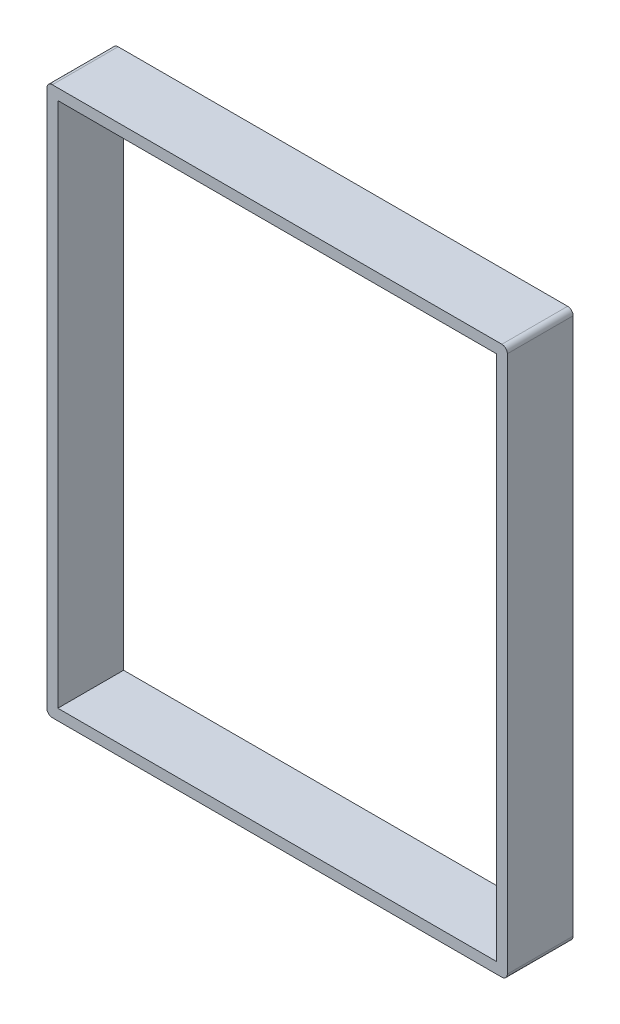
ISO-10303-21;
HEADER;
FILE_DESCRIPTION(('STEP AP214'),'2;1');
FILE_NAME('part.step','',(''),(''),'','','');
FILE_SCHEMA(('AUTOMOTIVE_DESIGN { 1 0 10303 214 1 1 1 1 }'));
ENDSEC;
DATA;
#1=APPLICATION_CONTEXT('core data for automotive mechanical design processes');
#2=APPLICATION_PROTOCOL_DEFINITION('international standard','automotive_design',2000,#1);
#3=PRODUCT_CONTEXT('',#1,'mechanical');
#4=PRODUCT('Part','Part','',(#3));
#5=PRODUCT_RELATED_PRODUCT_CATEGORY('part','',(#4));
#6=PRODUCT_DEFINITION_FORMATION('','',#4);
#7=PRODUCT_DEFINITION_CONTEXT('part definition',#1,'design');
#8=PRODUCT_DEFINITION('design','',#6,#7);
#9=PRODUCT_DEFINITION_SHAPE('','',#8);
#10=(LENGTH_UNIT() NAMED_UNIT(*) SI_UNIT(.MILLI.,.METRE.));
#11=(NAMED_UNIT(*) PLANE_ANGLE_UNIT() SI_UNIT($,.RADIAN.));
#12=(NAMED_UNIT(*) SI_UNIT($,.STERADIAN.) SOLID_ANGLE_UNIT());
#13=UNCERTAINTY_MEASURE_WITH_UNIT(LENGTH_MEASURE(1.E-05),#10,'distance_accuracy_value','');
#14=(GEOMETRIC_REPRESENTATION_CONTEXT(3) GLOBAL_UNCERTAINTY_ASSIGNED_CONTEXT((#13)) GLOBAL_UNIT_ASSIGNED_CONTEXT((#10,
#11,#12)) REPRESENTATION_CONTEXT('',''));
#15=CARTESIAN_POINT('',(0.,0.,0.));
#16=DIRECTION('',(0.,0.,1.));
#17=DIRECTION('',(1.,0.,0.));
#18=AXIS2_PLACEMENT_3D('',#15,#16,#17);
#19=CARTESIAN_POINT('',(266.7,-317.5,76.2));
#20=DIRECTION('',(-1.,0.,0.));
#21=DIRECTION('',(0.,0.,1.));
#22=AXIS2_PLACEMENT_3D('',#19,#20,#21);
#23=PLANE('',#22);
#24=DIRECTION('',(0.,1.,0.));
#25=VECTOR('',#24,1.);
#26=CARTESIAN_POINT('',(266.7,-317.5,0.));
#27=LINE('',#26,#25);
#28=CARTESIAN_POINT('',(266.7,-311.15,0.));
#29=VERTEX_POINT('',#28);
#30=CARTESIAN_POINT('',(266.7,311.15,0.));
#31=VERTEX_POINT('',#30);
#32=EDGE_CURVE('E179',#29,#31,#27,.T.);
#33=ORIENTED_EDGE('',*,*,#32,.T.);
#34=DIRECTION('',(0.,0.,-1.));
#35=VECTOR('',#34,1.);
#36=CARTESIAN_POINT('',(266.7,311.15,76.2));
#37=LINE('',#36,#35);
#38=CARTESIAN_POINT('',(266.7,311.15,76.2));
#39=VERTEX_POINT('',#38);
#40=EDGE_CURVE('E254',#31,#39,#37,.F.);
#41=ORIENTED_EDGE('',*,*,#40,.T.);
#42=DIRECTION('',(0.,1.,0.));
#43=VECTOR('',#42,1.);
#44=CARTESIAN_POINT('',(266.7,-317.5,76.2));
#45=LINE('',#44,#43);
#46=CARTESIAN_POINT('',(266.7,-311.15,76.2));
#47=VERTEX_POINT('',#46);
#48=EDGE_CURVE('E185',#47,#39,#45,.T.);
#49=ORIENTED_EDGE('',*,*,#48,.F.);
#50=DIRECTION('',(0.,0.,-1.));
#51=VECTOR('',#50,1.);
#52=CARTESIAN_POINT('',(266.7,-311.15,76.2));
#53=LINE('',#52,#51);
#54=EDGE_CURVE('E250',#47,#29,#53,.T.);
#55=ORIENTED_EDGE('',*,*,#54,.T.);
#56=EDGE_LOOP('',(#33,#41,#49,#55));
#57=FACE_BOUND('',#56,.T.);
#58=ADVANCED_FACE('F39',(#57),#23,.F.);
#59=CARTESIAN_POINT('',(-266.7,317.5,76.2));
#60=DIRECTION('',(0.,-1.,0.));
#61=DIRECTION('',(0.,0.,-1.));
#62=AXIS2_PLACEMENT_3D('',#59,#60,#61);
#63=PLANE('',#62);
#64=DIRECTION('',(-1.,0.,0.));
#65=VECTOR('',#64,1.);
#66=CARTESIAN_POINT('',(-266.7,317.5,0.));
#67=LINE('',#66,#65);
#68=CARTESIAN_POINT('',(260.35,317.5,0.));
#69=VERTEX_POINT('',#68);
#70=CARTESIAN_POINT('',(-260.35,317.5,0.));
#71=VERTEX_POINT('',#70);
#72=EDGE_CURVE('E204',#69,#71,#67,.T.);
#73=ORIENTED_EDGE('',*,*,#72,.T.);
#74=DIRECTION('',(0.,0.,-1.));
#75=VECTOR('',#74,1.);
#76=CARTESIAN_POINT('',(-260.35,317.5,76.2));
#77=LINE('',#76,#75);
#78=CARTESIAN_POINT('',(-260.35,317.5,76.2));
#79=VERTEX_POINT('',#78);
#80=EDGE_CURVE('E236',#71,#79,#77,.F.);
#81=ORIENTED_EDGE('',*,*,#80,.T.);
#82=DIRECTION('',(-1.,0.,0.));
#83=VECTOR('',#82,1.);
#84=CARTESIAN_POINT('',(-266.7,317.5,76.2));
#85=LINE('',#84,#83);
#86=CARTESIAN_POINT('',(260.35,317.5,76.2));
#87=VERTEX_POINT('',#86);
#88=EDGE_CURVE('E189',#87,#79,#85,.T.);
#89=ORIENTED_EDGE('',*,*,#88,.F.);
#90=DIRECTION('',(0.,0.,-1.));
#91=VECTOR('',#90,1.);
#92=CARTESIAN_POINT('',(260.35,317.5,76.2));
#93=LINE('',#92,#91);
#94=EDGE_CURVE('E232',#87,#69,#93,.T.);
#95=ORIENTED_EDGE('',*,*,#94,.T.);
#96=EDGE_LOOP('',(#73,#81,#89,#95));
#97=FACE_BOUND('',#96,.T.);
#98=ADVANCED_FACE('F279',(#97),#63,.F.);
#99=CARTESIAN_POINT('',(-266.7,-317.5,76.2));
#100=DIRECTION('',(1.,0.,0.));
#101=DIRECTION('',(0.,0.,-1.));
#102=AXIS2_PLACEMENT_3D('',#99,#100,#101);
#103=PLANE('',#102);
#104=DIRECTION('',(0.,-1.,0.));
#105=VECTOR('',#104,1.);
#106=CARTESIAN_POINT('',(-266.7,-317.5,76.2));
#107=LINE('',#106,#105);
#108=CARTESIAN_POINT('',(-266.7,311.15,76.2));
#109=VERTEX_POINT('',#108);
#110=CARTESIAN_POINT('',(-266.7,-311.15,76.2));
#111=VERTEX_POINT('',#110);
#112=EDGE_CURVE('E194',#109,#111,#107,.T.);
#113=ORIENTED_EDGE('',*,*,#112,.F.);
#114=DIRECTION('',(0.,0.,-1.));
#115=VECTOR('',#114,1.);
#116=CARTESIAN_POINT('',(-266.7,311.15,76.2));
#117=LINE('',#116,#115);
#118=CARTESIAN_POINT('',(-266.7,311.15,0.));
#119=VERTEX_POINT('',#118);
#120=EDGE_CURVE('E216',#109,#119,#117,.T.);
#121=ORIENTED_EDGE('',*,*,#120,.T.);
#122=DIRECTION('',(0.,-1.,0.));
#123=VECTOR('',#122,1.);
#124=CARTESIAN_POINT('',(-266.7,-317.5,0.));
#125=LINE('',#124,#123);
#126=CARTESIAN_POINT('',(-266.7,-311.15,0.));
#127=VERTEX_POINT('',#126);
#128=EDGE_CURVE('E208',#119,#127,#125,.T.);
#129=ORIENTED_EDGE('',*,*,#128,.T.);
#130=DIRECTION('',(0.,0.,-1.));
#131=VECTOR('',#130,1.);
#132=CARTESIAN_POINT('',(-266.7,-311.15,76.2));
#133=LINE('',#132,#131);
#134=EDGE_CURVE('E200',#127,#111,#133,.F.);
#135=ORIENTED_EDGE('',*,*,#134,.T.);
#136=EDGE_LOOP('',(#113,#121,#129,#135));
#137=FACE_BOUND('',#136,.T.);
#138=ADVANCED_FACE('F287',(#137),#103,.F.);
#139=CARTESIAN_POINT('',(-266.7,-317.5,76.2));
#140=DIRECTION('',(0.,1.,0.));
#141=DIRECTION('',(0.,0.,1.));
#142=AXIS2_PLACEMENT_3D('',#139,#140,#141);
#143=PLANE('',#142);
#144=DIRECTION('',(1.,0.,0.));
#145=VECTOR('',#144,1.);
#146=CARTESIAN_POINT('',(-266.7,-317.5,0.));
#147=LINE('',#146,#145);
#148=CARTESIAN_POINT('',(-260.35,-317.5,0.));
#149=VERTEX_POINT('',#148);
#150=CARTESIAN_POINT('',(260.35,-317.5,0.));
#151=VERTEX_POINT('',#150);
#152=EDGE_CURVE('E190',#149,#151,#147,.T.);
#153=ORIENTED_EDGE('',*,*,#152,.T.);
#154=DIRECTION('',(0.,0.,-1.));
#155=VECTOR('',#154,1.);
#156=CARTESIAN_POINT('',(260.35,-317.5,76.2));
#157=LINE('',#156,#155);
#158=CARTESIAN_POINT('',(260.35,-317.5,76.2));
#159=VERTEX_POINT('',#158);
#160=EDGE_CURVE('E11',#151,#159,#157,.F.);
#161=ORIENTED_EDGE('',*,*,#160,.T.);
#162=DIRECTION('',(1.,0.,0.));
#163=VECTOR('',#162,1.);
#164=CARTESIAN_POINT('',(-266.7,-317.5,76.2));
#165=LINE('',#164,#163);
#166=CARTESIAN_POINT('',(-260.35,-317.5,76.2));
#167=VERTEX_POINT('',#166);
#168=EDGE_CURVE('E197',#167,#159,#165,.T.);
#169=ORIENTED_EDGE('',*,*,#168,.F.);
#170=DIRECTION('',(0.,0.,-1.));
#171=VECTOR('',#170,1.);
#172=CARTESIAN_POINT('',(-260.35,-317.5,76.2));
#173=LINE('',#172,#171);
#174=EDGE_CURVE('E48',#167,#149,#173,.T.);
#175=ORIENTED_EDGE('',*,*,#174,.T.);
#176=EDGE_LOOP('',(#153,#161,#169,#175));
#177=FACE_BOUND('',#176,.T.);
#178=ADVANCED_FACE('F260',(#177),#143,.F.);
#179=CARTESIAN_POINT('',(0.,0.,76.2));
#180=DIRECTION('',(0.,0.,-1.));
#181=DIRECTION('',(-1.,0.,0.));
#182=AXIS2_PLACEMENT_3D('',#179,#180,#181);
#183=PLANE('',#182);
#184=DIRECTION('',(-1.,0.,0.));
#185=VECTOR('',#184,1.);
#186=CARTESIAN_POINT('',(-254.,304.8,76.2));
#187=LINE('',#186,#185);
#188=CARTESIAN_POINT('',(254.,304.8,76.2));
#189=VERTEX_POINT('',#188);
#190=CARTESIAN_POINT('',(-254.,304.8,76.2));
#191=VERTEX_POINT('',#190);
#192=EDGE_CURVE('E170',#189,#191,#187,.T.);
#193=ORIENTED_EDGE('',*,*,#192,.F.);
#194=DIRECTION('',(0.,1.,0.));
#195=VECTOR('',#194,1.);
#196=CARTESIAN_POINT('',(254.,-304.8,76.2));
#197=LINE('',#196,#195);
#198=CARTESIAN_POINT('',(254.,-304.8,76.2));
#199=VERTEX_POINT('',#198);
#200=EDGE_CURVE('E136',#199,#189,#197,.T.);
#201=ORIENTED_EDGE('',*,*,#200,.F.);
#202=DIRECTION('',(1.,0.,0.));
#203=VECTOR('',#202,1.);
#204=CARTESIAN_POINT('',(-254.,-304.8,76.2));
#205=LINE('',#204,#203);
#206=CARTESIAN_POINT('',(-254.,-304.8,76.2));
#207=VERTEX_POINT('',#206);
#208=EDGE_CURVE('E157',#207,#199,#205,.T.);
#209=ORIENTED_EDGE('',*,*,#208,.F.);
#210=DIRECTION('',(0.,-1.,0.));
#211=VECTOR('',#210,1.);
#212=CARTESIAN_POINT('',(-254.,-304.8,76.2));
#213=LINE('',#212,#211);
#214=EDGE_CURVE('E161',#191,#207,#213,.T.);
#215=ORIENTED_EDGE('',*,*,#214,.F.);
#216=EDGE_LOOP('',(#193,#201,#209,#215));
#217=FACE_BOUND('',#216,.T.);
#218=ORIENTED_EDGE('',*,*,#88,.T.);
#219=CARTESIAN_POINT('',(-260.35,311.15,76.2));
#220=DIRECTION('',(0.,0.,-1.));
#221=DIRECTION('',(-1.,0.,0.));
#222=AXIS2_PLACEMENT_3D('',#219,#220,#221);
#223=CIRCLE('',#222,6.35);
#224=EDGE_CURVE('E247',#79,#109,#223,.F.);
#225=ORIENTED_EDGE('',*,*,#224,.T.);
#226=ORIENTED_EDGE('',*,*,#112,.T.);
#227=CARTESIAN_POINT('',(-260.35,-311.15,76.2));
#228=DIRECTION('',(0.,0.,-1.));
#229=DIRECTION('',(-1.,0.,0.));
#230=AXIS2_PLACEMENT_3D('',#227,#228,#229);
#231=CIRCLE('',#230,6.35);
#232=EDGE_CURVE('E60',#111,#167,#231,.F.);
#233=ORIENTED_EDGE('',*,*,#232,.T.);
#234=ORIENTED_EDGE('',*,*,#168,.T.);
#235=CARTESIAN_POINT('',(260.35,-311.15,76.2));
#236=DIRECTION('',(0.,0.,-1.));
#237=DIRECTION('',(-1.,0.,0.));
#238=AXIS2_PLACEMENT_3D('',#235,#236,#237);
#239=CIRCLE('',#238,6.35);
#240=EDGE_CURVE('E241',#159,#47,#239,.F.);
#241=ORIENTED_EDGE('',*,*,#240,.T.);
#242=ORIENTED_EDGE('',*,*,#48,.T.);
#243=CARTESIAN_POINT('',(260.35,311.15,76.2));
#244=DIRECTION('',(0.,0.,-1.));
#245=DIRECTION('',(-1.,0.,0.));
#246=AXIS2_PLACEMENT_3D('',#243,#244,#245);
#247=CIRCLE('',#246,6.35);
#248=EDGE_CURVE('E244',#39,#87,#247,.F.);
#249=ORIENTED_EDGE('',*,*,#248,.T.);
#250=EDGE_LOOP('',(#218,#225,#226,#233,#234,#241,#242,#249));
#251=FACE_BOUND('',#250,.T.);
#252=ADVANCED_FACE('F272',(#217,#251),#183,.F.);
#253=CARTESIAN_POINT('',(0.,0.,0.));
#254=DIRECTION('',(0.,0.,-1.));
#255=DIRECTION('',(-1.,0.,0.));
#256=AXIS2_PLACEMENT_3D('',#253,#254,#255);
#257=PLANE('',#256);
#258=DIRECTION('',(0.,1.,0.));
#259=VECTOR('',#258,1.);
#260=CARTESIAN_POINT('',(254.,-304.8,0.));
#261=LINE('',#260,#259);
#262=CARTESIAN_POINT('',(254.,-304.8,0.));
#263=VERTEX_POINT('',#262);
#264=CARTESIAN_POINT('',(254.,304.8,0.));
#265=VERTEX_POINT('',#264);
#266=EDGE_CURVE('E133',#263,#265,#261,.T.);
#267=ORIENTED_EDGE('',*,*,#266,.T.);
#268=DIRECTION('',(-1.,0.,0.));
#269=VECTOR('',#268,1.);
#270=CARTESIAN_POINT('',(-254.,304.8,0.));
#271=LINE('',#270,#269);
#272=CARTESIAN_POINT('',(-254.,304.8,0.));
#273=VERTEX_POINT('',#272);
#274=EDGE_CURVE('E146',#265,#273,#271,.T.);
#275=ORIENTED_EDGE('',*,*,#274,.T.);
#276=DIRECTION('',(0.,-1.,0.));
#277=VECTOR('',#276,1.);
#278=CARTESIAN_POINT('',(-254.,-304.8,0.));
#279=LINE('',#278,#277);
#280=CARTESIAN_POINT('',(-254.,-304.8,0.));
#281=VERTEX_POINT('',#280);
#282=EDGE_CURVE('E151',#273,#281,#279,.T.);
#283=ORIENTED_EDGE('',*,*,#282,.T.);
#284=DIRECTION('',(1.,0.,0.));
#285=VECTOR('',#284,1.);
#286=CARTESIAN_POINT('',(-254.,-304.8,0.));
#287=LINE('',#286,#285);
#288=EDGE_CURVE('E142',#281,#263,#287,.T.);
#289=ORIENTED_EDGE('',*,*,#288,.T.);
#290=EDGE_LOOP('',(#267,#275,#283,#289));
#291=FACE_BOUND('',#290,.T.);
#292=ORIENTED_EDGE('',*,*,#128,.F.);
#293=CARTESIAN_POINT('',(-260.35,311.15,0.));
#294=DIRECTION('',(0.,0.,-1.));
#295=DIRECTION('',(-1.,0.,0.));
#296=AXIS2_PLACEMENT_3D('',#293,#294,#295);
#297=CIRCLE('',#296,6.35);
#298=EDGE_CURVE('E229',#119,#71,#297,.T.);
#299=ORIENTED_EDGE('',*,*,#298,.T.);
#300=ORIENTED_EDGE('',*,*,#72,.F.);
#301=CARTESIAN_POINT('',(260.35,311.15,0.));
#302=DIRECTION('',(0.,0.,-1.));
#303=DIRECTION('',(-1.,0.,0.));
#304=AXIS2_PLACEMENT_3D('',#301,#302,#303);
#305=CIRCLE('',#304,6.35);
#306=EDGE_CURVE('E226',#69,#31,#305,.T.);
#307=ORIENTED_EDGE('',*,*,#306,.T.);
#308=ORIENTED_EDGE('',*,*,#32,.F.);
#309=CARTESIAN_POINT('',(260.35,-311.15,0.));
#310=DIRECTION('',(0.,0.,-1.));
#311=DIRECTION('',(-1.,0.,0.));
#312=AXIS2_PLACEMENT_3D('',#309,#310,#311);
#313=CIRCLE('',#312,6.35);
#314=EDGE_CURVE('E223',#29,#151,#313,.T.);
#315=ORIENTED_EDGE('',*,*,#314,.T.);
#316=ORIENTED_EDGE('',*,*,#152,.F.);
#317=CARTESIAN_POINT('',(-260.35,-311.15,0.));
#318=DIRECTION('',(0.,0.,-1.));
#319=DIRECTION('',(-1.,0.,0.));
#320=AXIS2_PLACEMENT_3D('',#317,#318,#319);
#321=CIRCLE('',#320,6.35);
#322=EDGE_CURVE('E220',#149,#127,#321,.T.);
#323=ORIENTED_EDGE('',*,*,#322,.T.);
#324=EDGE_LOOP('',(#292,#299,#300,#307,#308,#315,#316,#323));
#325=FACE_BOUND('',#324,.T.);
#326=ADVANCED_FACE('F153',(#291,#325),#257,.T.);
#327=CARTESIAN_POINT('',(254.,-304.8,0.));
#328=DIRECTION('',(1.,0.,0.));
#329=DIRECTION('',(0.,0.,-1.));
#330=AXIS2_PLACEMENT_3D('',#327,#328,#329);
#331=PLANE('',#330);
#332=ORIENTED_EDGE('',*,*,#200,.T.);
#333=DIRECTION('',(0.,0.,1.));
#334=VECTOR('',#333,1.);
#335=CARTESIAN_POINT('',(254.,304.8,0.));
#336=LINE('',#335,#334);
#337=EDGE_CURVE('E129',#265,#189,#336,.T.);
#338=ORIENTED_EDGE('',*,*,#337,.F.);
#339=ORIENTED_EDGE('',*,*,#266,.F.);
#340=DIRECTION('',(0.,0.,1.));
#341=VECTOR('',#340,1.);
#342=CARTESIAN_POINT('',(254.,-304.8,0.));
#343=LINE('',#342,#341);
#344=EDGE_CURVE('E176',#263,#199,#343,.T.);
#345=ORIENTED_EDGE('',*,*,#344,.T.);
#346=EDGE_LOOP('',(#332,#338,#339,#345));
#347=FACE_BOUND('',#346,.T.);
#348=ADVANCED_FACE('F131',(#347),#331,.F.);
#349=CARTESIAN_POINT('',(-254.,-304.8,0.));
#350=DIRECTION('',(0.,-1.,0.));
#351=DIRECTION('',(0.,0.,-1.));
#352=AXIS2_PLACEMENT_3D('',#349,#350,#351);
#353=PLANE('',#352);
#354=ORIENTED_EDGE('',*,*,#208,.T.);
#355=ORIENTED_EDGE('',*,*,#344,.F.);
#356=ORIENTED_EDGE('',*,*,#288,.F.);
#357=DIRECTION('',(0.,0.,1.));
#358=VECTOR('',#357,1.);
#359=CARTESIAN_POINT('',(-254.,-304.8,0.));
#360=LINE('',#359,#358);
#361=EDGE_CURVE('E180',#281,#207,#360,.T.);
#362=ORIENTED_EDGE('',*,*,#361,.T.);
#363=EDGE_LOOP('',(#354,#355,#356,#362));
#364=FACE_BOUND('',#363,.T.);
#365=ADVANCED_FACE('F341',(#364),#353,.F.);
#366=CARTESIAN_POINT('',(-254.,-304.8,0.));
#367=DIRECTION('',(-1.,0.,0.));
#368=DIRECTION('',(0.,0.,1.));
#369=AXIS2_PLACEMENT_3D('',#366,#367,#368);
#370=PLANE('',#369);
#371=ORIENTED_EDGE('',*,*,#214,.T.);
#372=ORIENTED_EDGE('',*,*,#361,.F.);
#373=ORIENTED_EDGE('',*,*,#282,.F.);
#374=DIRECTION('',(0.,0.,1.));
#375=VECTOR('',#374,1.);
#376=CARTESIAN_POINT('',(-254.,304.8,0.));
#377=LINE('',#376,#375);
#378=EDGE_CURVE('E141',#273,#191,#377,.T.);
#379=ORIENTED_EDGE('',*,*,#378,.T.);
#380=EDGE_LOOP('',(#371,#372,#373,#379));
#381=FACE_BOUND('',#380,.T.);
#382=ADVANCED_FACE('F333',(#381),#370,.F.);
#383=CARTESIAN_POINT('',(-254.,304.8,0.));
#384=DIRECTION('',(0.,1.,0.));
#385=DIRECTION('',(0.,0.,1.));
#386=AXIS2_PLACEMENT_3D('',#383,#384,#385);
#387=PLANE('',#386);
#388=ORIENTED_EDGE('',*,*,#192,.T.);
#389=ORIENTED_EDGE('',*,*,#378,.F.);
#390=ORIENTED_EDGE('',*,*,#274,.F.);
#391=ORIENTED_EDGE('',*,*,#337,.T.);
#392=EDGE_LOOP('',(#388,#389,#390,#391));
#393=FACE_BOUND('',#392,.T.);
#394=ADVANCED_FACE('F147',(#393),#387,.F.);
#395=CARTESIAN_POINT('',(-260.35,311.15,76.2));
#396=DIRECTION('',(0.,0.,-1.));
#397=DIRECTION('',(-1.,0.,0.));
#398=AXIS2_PLACEMENT_3D('',#395,#396,#397);
#399=CYLINDRICAL_SURFACE('',#398,6.35);
#400=ORIENTED_EDGE('',*,*,#224,.F.);
#401=ORIENTED_EDGE('',*,*,#80,.F.);
#402=ORIENTED_EDGE('',*,*,#298,.F.);
#403=ORIENTED_EDGE('',*,*,#120,.F.);
#404=EDGE_LOOP('',(#400,#401,#402,#403));
#405=FACE_BOUND('',#404,.T.);
#406=ADVANCED_FACE('F284',(#405),#399,.T.);
#407=CARTESIAN_POINT('',(260.35,311.15,76.2));
#408=DIRECTION('',(0.,0.,-1.));
#409=DIRECTION('',(-1.,0.,0.));
#410=AXIS2_PLACEMENT_3D('',#407,#408,#409);
#411=CYLINDRICAL_SURFACE('',#410,6.35);
#412=ORIENTED_EDGE('',*,*,#248,.F.);
#413=ORIENTED_EDGE('',*,*,#40,.F.);
#414=ORIENTED_EDGE('',*,*,#306,.F.);
#415=ORIENTED_EDGE('',*,*,#94,.F.);
#416=EDGE_LOOP('',(#412,#413,#414,#415));
#417=FACE_BOUND('',#416,.T.);
#418=ADVANCED_FACE('F276',(#417),#411,.T.);
#419=CARTESIAN_POINT('',(260.35,-311.15,76.2));
#420=DIRECTION('',(0.,0.,-1.));
#421=DIRECTION('',(-1.,0.,0.));
#422=AXIS2_PLACEMENT_3D('',#419,#420,#421);
#423=CYLINDRICAL_SURFACE('',#422,6.35);
#424=ORIENTED_EDGE('',*,*,#240,.F.);
#425=ORIENTED_EDGE('',*,*,#160,.F.);
#426=ORIENTED_EDGE('',*,*,#314,.F.);
#427=ORIENTED_EDGE('',*,*,#54,.F.);
#428=EDGE_LOOP('',(#424,#425,#426,#427));
#429=FACE_BOUND('',#428,.T.);
#430=ADVANCED_FACE('F267',(#429),#423,.T.);
#431=CARTESIAN_POINT('',(-260.35,-311.15,76.2));
#432=DIRECTION('',(0.,0.,-1.));
#433=DIRECTION('',(-1.,0.,0.));
#434=AXIS2_PLACEMENT_3D('',#431,#432,#433);
#435=CYLINDRICAL_SURFACE('',#434,6.35);
#436=ORIENTED_EDGE('',*,*,#232,.F.);
#437=ORIENTED_EDGE('',*,*,#134,.F.);
#438=ORIENTED_EDGE('',*,*,#322,.F.);
#439=ORIENTED_EDGE('',*,*,#174,.F.);
#440=EDGE_LOOP('',(#436,#437,#438,#439));
#441=FACE_BOUND('',#440,.T.);
#442=ADVANCED_FACE('F41',(#441),#435,.T.);
#443=CLOSED_SHELL('',(#58,#98,#138,#178,#252,#326,#348,#365,#382,#394,#406,#418,#430,#442));
#444=MANIFOLD_SOLID_BREP('B2',#443);
#445=ADVANCED_BREP_SHAPE_REPRESENTATION('',(#18,#444),#14);
#446=SHAPE_DEFINITION_REPRESENTATION(#9,#445);
ENDSEC;
END-ISO-10303-21;
